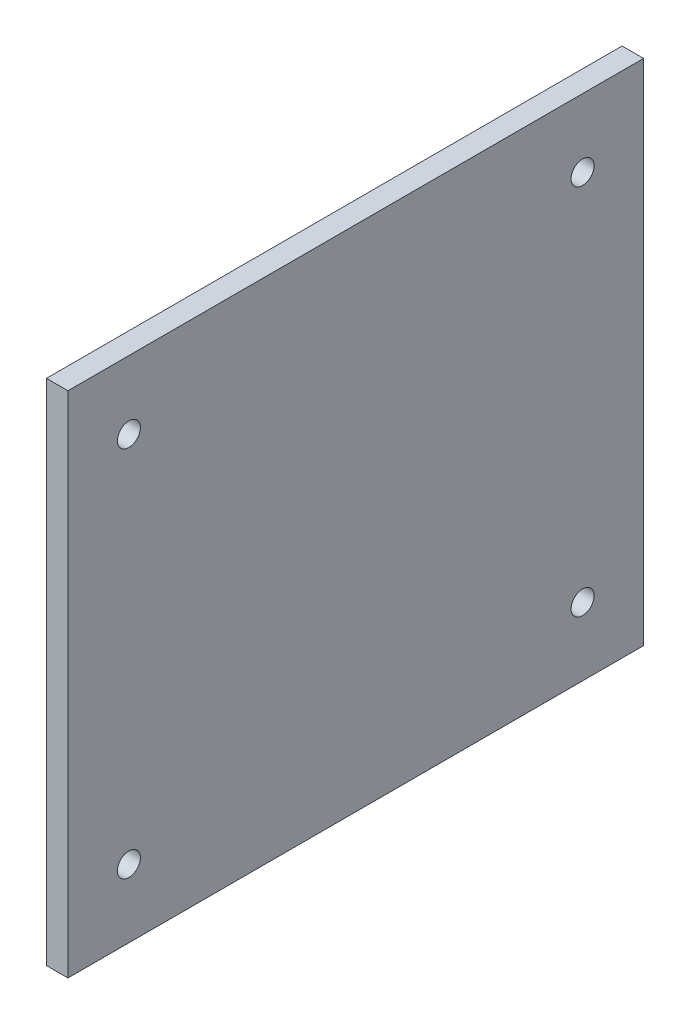
ISO-10303-21;
HEADER;
FILE_DESCRIPTION(('STEP AP214'),'2;1');
FILE_NAME('part.step','',(''),(''),'','','');
FILE_SCHEMA(('AUTOMOTIVE_DESIGN { 1 0 10303 214 1 1 1 1 }'));
ENDSEC;
DATA;
#1=APPLICATION_CONTEXT('core data for automotive mechanical design processes');
#2=APPLICATION_PROTOCOL_DEFINITION('international standard','automotive_design',2000,#1);
#3=PRODUCT_CONTEXT('',#1,'mechanical');
#4=PRODUCT('Part','Part','',(#3));
#5=PRODUCT_RELATED_PRODUCT_CATEGORY('part','',(#4));
#6=PRODUCT_DEFINITION_FORMATION('','',#4);
#7=PRODUCT_DEFINITION_CONTEXT('part definition',#1,'design');
#8=PRODUCT_DEFINITION('design','',#6,#7);
#9=PRODUCT_DEFINITION_SHAPE('','',#8);
#10=(LENGTH_UNIT() NAMED_UNIT(*) SI_UNIT(.MILLI.,.METRE.));
#11=(NAMED_UNIT(*) PLANE_ANGLE_UNIT() SI_UNIT($,.RADIAN.));
#12=(NAMED_UNIT(*) SI_UNIT($,.STERADIAN.) SOLID_ANGLE_UNIT());
#13=UNCERTAINTY_MEASURE_WITH_UNIT(LENGTH_MEASURE(1.E-05),#10,'distance_accuracy_value','');
#14=(GEOMETRIC_REPRESENTATION_CONTEXT(3) GLOBAL_UNCERTAINTY_ASSIGNED_CONTEXT((#13)) GLOBAL_UNIT_ASSIGNED_CONTEXT((#10,
#11,#12)) REPRESENTATION_CONTEXT('',''));
#15=CARTESIAN_POINT('',(0.,0.,0.));
#16=DIRECTION('',(0.,0.,1.));
#17=DIRECTION('',(1.,0.,0.));
#18=AXIS2_PLACEMENT_3D('',#15,#16,#17);
#19=CARTESIAN_POINT('',(3.175,0.,0.));
#20=DIRECTION('',(-1.,0.,0.));
#21=DIRECTION('',(0.,0.,1.));
#22=AXIS2_PLACEMENT_3D('',#19,#20,#21);
#23=PLANE('',#22);
#24=DIRECTION('',(0.,-1.,0.));
#25=VECTOR('',#24,1.);
#26=CARTESIAN_POINT('',(3.175,0.,0.));
#27=LINE('',#26,#25);
#28=CARTESIAN_POINT('',(3.175,75.1,0.));
#29=VERTEX_POINT('',#28);
#30=CARTESIAN_POINT('',(3.175,0.,0.));
#31=VERTEX_POINT('',#30);
#32=EDGE_CURVE('E97',#29,#31,#27,.T.);
#33=ORIENTED_EDGE('',*,*,#32,.T.);
#34=DIRECTION('',(0.,0.,-1.));
#35=VECTOR('',#34,1.);
#36=CARTESIAN_POINT('',(3.175,0.,0.));
#37=LINE('',#36,#35);
#38=CARTESIAN_POINT('',(3.175,0.,-85.));
#39=VERTEX_POINT('',#38);
#40=EDGE_CURVE('E92',#31,#39,#37,.T.);
#41=ORIENTED_EDGE('',*,*,#40,.T.);
#42=DIRECTION('',(0.,1.,0.));
#43=VECTOR('',#42,1.);
#44=CARTESIAN_POINT('',(3.175,0.,-85.));
#45=LINE('',#44,#43);
#46=CARTESIAN_POINT('',(3.175,75.1,-85.));
#47=VERTEX_POINT('',#46);
#48=EDGE_CURVE('E95',#39,#47,#45,.T.);
#49=ORIENTED_EDGE('',*,*,#48,.T.);
#50=DIRECTION('',(0.,0.,1.));
#51=VECTOR('',#50,1.);
#52=CARTESIAN_POINT('',(3.175,75.1,0.));
#53=LINE('',#52,#51);
#54=EDGE_CURVE('E62',#47,#29,#53,.T.);
#55=ORIENTED_EDGE('',*,*,#54,.T.);
#56=EDGE_LOOP('',(#33,#41,#49,#55));
#57=FACE_BOUND('',#56,.T.);
#58=CARTESIAN_POINT('',(3.175,65.05,-9.));
#59=DIRECTION('',(1.,0.,0.));
#60=DIRECTION('',(0.,0.,-1.));
#61=AXIS2_PLACEMENT_3D('',#58,#59,#60);
#62=CIRCLE('',#61,1.70000000000001);
#63=CARTESIAN_POINT('',(3.175,65.05,-10.7));
#64=VERTEX_POINT('',#63);
#65=EDGE_CURVE('E124',#64,#64,#62,.T.);
#66=ORIENTED_EDGE('',*,*,#65,.F.);
#67=EDGE_LOOP('',(#66));
#68=FACE_BOUND('',#67,.T.);
#69=CARTESIAN_POINT('',(3.175,10.05,-9.));
#70=DIRECTION('',(1.,0.,0.));
#71=DIRECTION('',(0.,0.,1.));
#72=AXIS2_PLACEMENT_3D('',#69,#70,#71);
#73=CIRCLE('',#72,1.7);
#74=CARTESIAN_POINT('',(3.175,10.05,-7.3));
#75=VERTEX_POINT('',#74);
#76=EDGE_CURVE('E135',#75,#75,#73,.T.);
#77=ORIENTED_EDGE('',*,*,#76,.F.);
#78=EDGE_LOOP('',(#77));
#79=FACE_BOUND('',#78,.T.);
#80=CARTESIAN_POINT('',(3.175,10.05,-76.));
#81=DIRECTION('',(1.,0.,0.));
#82=DIRECTION('',(0.,0.,-1.));
#83=AXIS2_PLACEMENT_3D('',#80,#81,#82);
#84=CIRCLE('',#83,1.7);
#85=CARTESIAN_POINT('',(3.175,10.05,-77.7));
#86=VERTEX_POINT('',#85);
#87=EDGE_CURVE('E161',#86,#86,#84,.T.);
#88=ORIENTED_EDGE('',*,*,#87,.F.);
#89=EDGE_LOOP('',(#88));
#90=FACE_BOUND('',#89,.T.);
#91=CARTESIAN_POINT('',(3.175,65.05,-76.));
#92=DIRECTION('',(1.,0.,0.));
#93=DIRECTION('',(0.,0.,1.));
#94=AXIS2_PLACEMENT_3D('',#91,#92,#93);
#95=CIRCLE('',#94,1.7);
#96=CARTESIAN_POINT('',(3.175,65.05,-74.3));
#97=VERTEX_POINT('',#96);
#98=EDGE_CURVE('E168',#97,#97,#95,.T.);
#99=ORIENTED_EDGE('',*,*,#98,.F.);
#100=EDGE_LOOP('',(#99));
#101=FACE_BOUND('',#100,.T.);
#102=ADVANCED_FACE('F44',(#57,#68,#79,#90,#101),#23,.F.);
#103=CARTESIAN_POINT('',(0.,0.,0.));
#104=DIRECTION('',(-1.,0.,0.));
#105=DIRECTION('',(0.,0.,1.));
#106=AXIS2_PLACEMENT_3D('',#103,#104,#105);
#107=PLANE('',#106);
#108=CARTESIAN_POINT('',(0.,10.05,-76.));
#109=DIRECTION('',(1.,0.,0.));
#110=DIRECTION('',(0.,0.,-1.));
#111=AXIS2_PLACEMENT_3D('',#108,#109,#110);
#112=CIRCLE('',#111,1.7);
#113=CARTESIAN_POINT('',(0.,10.05,-77.7));
#114=VERTEX_POINT('',#113);
#115=EDGE_CURVE('E164',#114,#114,#112,.T.);
#116=ORIENTED_EDGE('',*,*,#115,.T.);
#117=EDGE_LOOP('',(#116));
#118=FACE_BOUND('',#117,.T.);
#119=CARTESIAN_POINT('',(0.,65.05,-9.));
#120=DIRECTION('',(1.,0.,0.));
#121=DIRECTION('',(0.,0.,-1.));
#122=AXIS2_PLACEMENT_3D('',#119,#120,#121);
#123=CIRCLE('',#122,1.70000000000001);
#124=CARTESIAN_POINT('',(0.,65.05,-10.7));
#125=VERTEX_POINT('',#124);
#126=EDGE_CURVE('E131',#125,#125,#123,.T.);
#127=ORIENTED_EDGE('',*,*,#126,.T.);
#128=EDGE_LOOP('',(#127));
#129=FACE_BOUND('',#128,.T.);
#130=DIRECTION('',(0.,-1.,0.));
#131=VECTOR('',#130,1.);
#132=CARTESIAN_POINT('',(0.,0.,0.));
#133=LINE('',#132,#131);
#134=CARTESIAN_POINT('',(0.,75.1,0.));
#135=VERTEX_POINT('',#134);
#136=CARTESIAN_POINT('',(0.,0.,0.));
#137=VERTEX_POINT('',#136);
#138=EDGE_CURVE('E130',#135,#137,#133,.T.);
#139=ORIENTED_EDGE('',*,*,#138,.F.);
#140=DIRECTION('',(0.,0.,1.));
#141=VECTOR('',#140,1.);
#142=CARTESIAN_POINT('',(0.,75.1,0.));
#143=LINE('',#142,#141);
#144=CARTESIAN_POINT('',(0.,75.1,-85.));
#145=VERTEX_POINT('',#144);
#146=EDGE_CURVE('E85',#145,#135,#143,.T.);
#147=ORIENTED_EDGE('',*,*,#146,.F.);
#148=DIRECTION('',(0.,1.,0.));
#149=VECTOR('',#148,1.);
#150=CARTESIAN_POINT('',(0.,0.,-85.));
#151=LINE('',#150,#149);
#152=CARTESIAN_POINT('',(0.,0.,-85.));
#153=VERTEX_POINT('',#152);
#154=EDGE_CURVE('E79',#153,#145,#151,.T.);
#155=ORIENTED_EDGE('',*,*,#154,.F.);
#156=DIRECTION('',(0.,0.,-1.));
#157=VECTOR('',#156,1.);
#158=CARTESIAN_POINT('',(0.,0.,0.));
#159=LINE('',#158,#157);
#160=EDGE_CURVE('E102',#137,#153,#159,.T.);
#161=ORIENTED_EDGE('',*,*,#160,.F.);
#162=EDGE_LOOP('',(#139,#147,#155,#161));
#163=FACE_BOUND('',#162,.T.);
#164=CARTESIAN_POINT('',(0.,10.05,-9.));
#165=DIRECTION('',(1.,0.,0.));
#166=DIRECTION('',(0.,0.,1.));
#167=AXIS2_PLACEMENT_3D('',#164,#165,#166);
#168=CIRCLE('',#167,1.7);
#169=CARTESIAN_POINT('',(0.,10.05,-7.3));
#170=VERTEX_POINT('',#169);
#171=EDGE_CURVE('E132',#170,#170,#168,.T.);
#172=ORIENTED_EDGE('',*,*,#171,.T.);
#173=EDGE_LOOP('',(#172));
#174=FACE_BOUND('',#173,.T.);
#175=CARTESIAN_POINT('',(0.,65.05,-76.));
#176=DIRECTION('',(1.,0.,0.));
#177=DIRECTION('',(0.,0.,1.));
#178=AXIS2_PLACEMENT_3D('',#175,#176,#177);
#179=CIRCLE('',#178,1.7);
#180=CARTESIAN_POINT('',(0.,65.05,-74.3));
#181=VERTEX_POINT('',#180);
#182=EDGE_CURVE('E172',#181,#181,#179,.T.);
#183=ORIENTED_EDGE('',*,*,#182,.T.);
#184=EDGE_LOOP('',(#183));
#185=FACE_BOUND('',#184,.T.);
#186=ADVANCED_FACE('F150',(#118,#129,#163,#174,#185),#107,.T.);
#187=CARTESIAN_POINT('',(3.175,0.,0.));
#188=DIRECTION('',(0.,0.,-1.));
#189=DIRECTION('',(-1.,0.,0.));
#190=AXIS2_PLACEMENT_3D('',#187,#188,#189);
#191=PLANE('',#190);
#192=ORIENTED_EDGE('',*,*,#138,.T.);
#193=DIRECTION('',(-1.,0.,0.));
#194=VECTOR('',#193,1.);
#195=CARTESIAN_POINT('',(3.175,0.,0.));
#196=LINE('',#195,#194);
#197=EDGE_CURVE('E12',#31,#137,#196,.T.);
#198=ORIENTED_EDGE('',*,*,#197,.F.);
#199=ORIENTED_EDGE('',*,*,#32,.F.);
#200=DIRECTION('',(-1.,0.,0.));
#201=VECTOR('',#200,1.);
#202=CARTESIAN_POINT('',(3.175,75.1,0.));
#203=LINE('',#202,#201);
#204=EDGE_CURVE('E109',#29,#135,#203,.T.);
#205=ORIENTED_EDGE('',*,*,#204,.T.);
#206=EDGE_LOOP('',(#192,#198,#199,#205));
#207=FACE_BOUND('',#206,.T.);
#208=ADVANCED_FACE('F46',(#207),#191,.F.);
#209=CARTESIAN_POINT('',(3.175,0.,0.));
#210=DIRECTION('',(0.,1.,0.));
#211=DIRECTION('',(0.,0.,1.));
#212=AXIS2_PLACEMENT_3D('',#209,#210,#211);
#213=PLANE('',#212);
#214=ORIENTED_EDGE('',*,*,#160,.T.);
#215=DIRECTION('',(-1.,0.,0.));
#216=VECTOR('',#215,1.);
#217=CARTESIAN_POINT('',(3.175,0.,-85.));
#218=LINE('',#217,#216);
#219=EDGE_CURVE('E54',#39,#153,#218,.T.);
#220=ORIENTED_EDGE('',*,*,#219,.F.);
#221=ORIENTED_EDGE('',*,*,#40,.F.);
#222=ORIENTED_EDGE('',*,*,#197,.T.);
#223=EDGE_LOOP('',(#214,#220,#221,#222));
#224=FACE_BOUND('',#223,.T.);
#225=ADVANCED_FACE('F101',(#224),#213,.F.);
#226=CARTESIAN_POINT('',(3.175,0.,-85.));
#227=DIRECTION('',(0.,0.,1.));
#228=DIRECTION('',(1.,0.,0.));
#229=AXIS2_PLACEMENT_3D('',#226,#227,#228);
#230=PLANE('',#229);
#231=ORIENTED_EDGE('',*,*,#154,.T.);
#232=DIRECTION('',(-1.,0.,0.));
#233=VECTOR('',#232,1.);
#234=CARTESIAN_POINT('',(3.175,75.1,-85.));
#235=LINE('',#234,#233);
#236=EDGE_CURVE('E104',#47,#145,#235,.T.);
#237=ORIENTED_EDGE('',*,*,#236,.F.);
#238=ORIENTED_EDGE('',*,*,#48,.F.);
#239=ORIENTED_EDGE('',*,*,#219,.T.);
#240=EDGE_LOOP('',(#231,#237,#238,#239));
#241=FACE_BOUND('',#240,.T.);
#242=ADVANCED_FACE('F105',(#241),#230,.F.);
#243=CARTESIAN_POINT('',(3.175,75.1,0.));
#244=DIRECTION('',(0.,-1.,0.));
#245=DIRECTION('',(0.,0.,-1.));
#246=AXIS2_PLACEMENT_3D('',#243,#244,#245);
#247=PLANE('',#246);
#248=ORIENTED_EDGE('',*,*,#146,.T.);
#249=ORIENTED_EDGE('',*,*,#204,.F.);
#250=ORIENTED_EDGE('',*,*,#54,.F.);
#251=ORIENTED_EDGE('',*,*,#236,.T.);
#252=EDGE_LOOP('',(#248,#249,#250,#251));
#253=FACE_BOUND('',#252,.T.);
#254=ADVANCED_FACE('F147',(#253),#247,.F.);
#255=CARTESIAN_POINT('',(3.175,65.05,-9.));
#256=DIRECTION('',(-1.,0.,0.));
#257=DIRECTION('',(0.,0.,1.));
#258=AXIS2_PLACEMENT_3D('',#255,#256,#257);
#259=CYLINDRICAL_SURFACE('',#258,1.70000000000001);
#260=ORIENTED_EDGE('',*,*,#65,.T.);
#261=EDGE_LOOP('',(#260));
#262=FACE_BOUND('',#261,.T.);
#263=ORIENTED_EDGE('',*,*,#126,.F.);
#264=EDGE_LOOP('',(#263));
#265=FACE_BOUND('',#264,.T.);
#266=ADVANCED_FACE('F200',(#262,#265),#259,.F.);
#267=CARTESIAN_POINT('',(3.175,10.05,-9.));
#268=DIRECTION('',(-1.,0.,0.));
#269=DIRECTION('',(0.,0.,1.));
#270=AXIS2_PLACEMENT_3D('',#267,#268,#269);
#271=CYLINDRICAL_SURFACE('',#270,1.7);
#272=ORIENTED_EDGE('',*,*,#76,.T.);
#273=EDGE_LOOP('',(#272));
#274=FACE_BOUND('',#273,.T.);
#275=ORIENTED_EDGE('',*,*,#171,.F.);
#276=EDGE_LOOP('',(#275));
#277=FACE_BOUND('',#276,.T.);
#278=ADVANCED_FACE('F189',(#274,#277),#271,.F.);
#279=CARTESIAN_POINT('',(3.175,10.05,-76.));
#280=DIRECTION('',(-1.,0.,0.));
#281=DIRECTION('',(0.,0.,1.));
#282=AXIS2_PLACEMENT_3D('',#279,#280,#281);
#283=CYLINDRICAL_SURFACE('',#282,1.7);
#284=ORIENTED_EDGE('',*,*,#87,.T.);
#285=EDGE_LOOP('',(#284));
#286=FACE_BOUND('',#285,.T.);
#287=ORIENTED_EDGE('',*,*,#115,.F.);
#288=EDGE_LOOP('',(#287));
#289=FACE_BOUND('',#288,.T.);
#290=ADVANCED_FACE('F183',(#286,#289),#283,.F.);
#291=CARTESIAN_POINT('',(3.175,65.05,-76.));
#292=DIRECTION('',(-1.,0.,0.));
#293=DIRECTION('',(0.,0.,1.));
#294=AXIS2_PLACEMENT_3D('',#291,#292,#293);
#295=CYLINDRICAL_SURFACE('',#294,1.7);
#296=ORIENTED_EDGE('',*,*,#98,.T.);
#297=EDGE_LOOP('',(#296));
#298=FACE_BOUND('',#297,.T.);
#299=ORIENTED_EDGE('',*,*,#182,.F.);
#300=EDGE_LOOP('',(#299));
#301=FACE_BOUND('',#300,.T.);
#302=ADVANCED_FACE('F181',(#298,#301),#295,.F.);
#303=CLOSED_SHELL('',(#102,#186,#208,#225,#242,#254,#266,#278,#290,#302));
#304=MANIFOLD_SOLID_BREP('B2',#303);
#305=ADVANCED_BREP_SHAPE_REPRESENTATION('',(#18,#304),#14);
#306=SHAPE_DEFINITION_REPRESENTATION(#9,#305);
ENDSEC;
END-ISO-10303-21;
